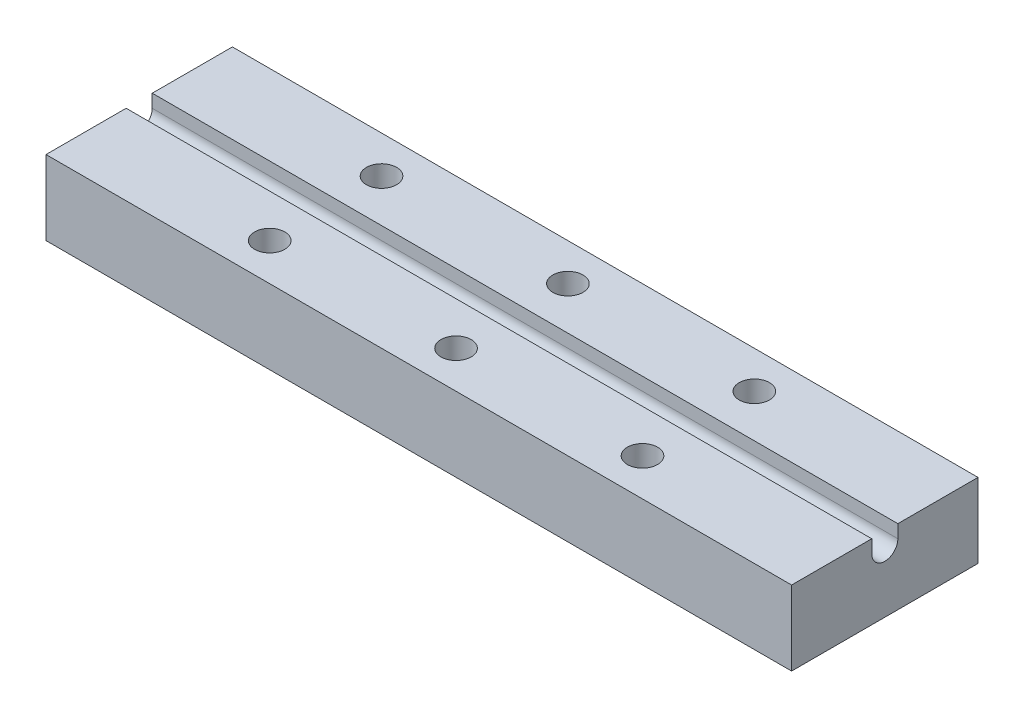
ISO-10303-21;
HEADER;
FILE_DESCRIPTION(('STEP AP214'),'2;1');
FILE_NAME('part.step','',(''),(''),'','','');
FILE_SCHEMA(('AUTOMOTIVE_DESIGN { 1 0 10303 214 1 1 1 1 }'));
ENDSEC;
DATA;
#1=APPLICATION_CONTEXT('core data for automotive mechanical design processes');
#2=APPLICATION_PROTOCOL_DEFINITION('international standard','automotive_design',2000,#1);
#3=PRODUCT_CONTEXT('',#1,'mechanical');
#4=PRODUCT('Part','Part','',(#3));
#5=PRODUCT_RELATED_PRODUCT_CATEGORY('part','',(#4));
#6=PRODUCT_DEFINITION_FORMATION('','',#4);
#7=PRODUCT_DEFINITION_CONTEXT('part definition',#1,'design');
#8=PRODUCT_DEFINITION('design','',#6,#7);
#9=PRODUCT_DEFINITION_SHAPE('','',#8);
#10=(LENGTH_UNIT() NAMED_UNIT(*) SI_UNIT(.MILLI.,.METRE.));
#11=(NAMED_UNIT(*) PLANE_ANGLE_UNIT() SI_UNIT($,.RADIAN.));
#12=(NAMED_UNIT(*) SI_UNIT($,.STERADIAN.) SOLID_ANGLE_UNIT());
#13=UNCERTAINTY_MEASURE_WITH_UNIT(LENGTH_MEASURE(1.E-05),#10,'distance_accuracy_value','');
#14=(GEOMETRIC_REPRESENTATION_CONTEXT(3) GLOBAL_UNCERTAINTY_ASSIGNED_CONTEXT((#13)) GLOBAL_UNIT_ASSIGNED_CONTEXT((#10,
#11,#12)) REPRESENTATION_CONTEXT('',''));
#15=CARTESIAN_POINT('',(0.,0.,0.));
#16=DIRECTION('',(0.,0.,1.));
#17=DIRECTION('',(1.,0.,0.));
#18=AXIS2_PLACEMENT_3D('',#15,#16,#17);
#19=CARTESIAN_POINT('',(0.,20.,0.));
#20=DIRECTION('',(0.,-1.,0.));
#21=DIRECTION('',(0.,0.,-1.));
#22=AXIS2_PLACEMENT_3D('',#19,#20,#21);
#23=PLANE('',#22);
#24=CARTESIAN_POINT('',(50.,20.,-10.0000000000007));
#25=DIRECTION('',(0.,-1.,0.));
#26=DIRECTION('',(0.,0.,-1.));
#27=AXIS2_PLACEMENT_3D('',#24,#25,#26);
#28=CIRCLE('',#27,4.04999999999999);
#29=CARTESIAN_POINT('',(50.,20.,-14.0500000000007));
#30=VERTEX_POINT('',#29);
#31=EDGE_CURVE('E180',#30,#30,#28,.T.);
#32=ORIENTED_EDGE('',*,*,#31,.T.);
#33=EDGE_LOOP('',(#32));
#34=FACE_BOUND('',#33,.T.);
#35=CARTESIAN_POINT('',(150.,20.,-10.));
#36=DIRECTION('',(0.,-1.,0.));
#37=DIRECTION('',(0.,0.,-1.));
#38=AXIS2_PLACEMENT_3D('',#35,#36,#37);
#39=CIRCLE('',#38,4.04999999999999);
#40=CARTESIAN_POINT('',(150.,20.,-14.05));
#41=VERTEX_POINT('',#40);
#42=EDGE_CURVE('E192',#41,#41,#39,.T.);
#43=ORIENTED_EDGE('',*,*,#42,.T.);
#44=EDGE_LOOP('',(#43));
#45=FACE_BOUND('',#44,.T.);
#46=CARTESIAN_POINT('',(100.,20.,-10.0000000000004));
#47=DIRECTION('',(0.,-1.,0.));
#48=DIRECTION('',(0.,0.,-1.));
#49=AXIS2_PLACEMENT_3D('',#46,#47,#48);
#50=CIRCLE('',#49,4.04999999999999);
#51=CARTESIAN_POINT('',(100.,20.,-14.0500000000003));
#52=VERTEX_POINT('',#51);
#53=EDGE_CURVE('E124',#52,#52,#50,.T.);
#54=ORIENTED_EDGE('',*,*,#53,.T.);
#55=EDGE_LOOP('',(#54));
#56=FACE_BOUND('',#55,.T.);
#57=DIRECTION('',(1.,0.,0.));
#58=VECTOR('',#57,1.);
#59=CARTESIAN_POINT('',(0.,20.,-21.5));
#60=LINE('',#59,#58);
#61=CARTESIAN_POINT('',(0.,20.,-21.5));
#62=VERTEX_POINT('',#61);
#63=CARTESIAN_POINT('',(200.,20.,-21.5));
#64=VERTEX_POINT('',#63);
#65=EDGE_CURVE('E161',#62,#64,#60,.T.);
#66=ORIENTED_EDGE('',*,*,#65,.F.);
#67=DIRECTION('',(0.,0.,1.));
#68=VECTOR('',#67,1.);
#69=CARTESIAN_POINT('',(0.,20.,0.));
#70=LINE('',#69,#68);
#71=CARTESIAN_POINT('',(0.,20.,0.));
#72=VERTEX_POINT('',#71);
#73=EDGE_CURVE('E86',#62,#72,#70,.T.);
#74=ORIENTED_EDGE('',*,*,#73,.T.);
#75=DIRECTION('',(1.,0.,0.));
#76=VECTOR('',#75,1.);
#77=CARTESIAN_POINT('',(0.,20.,0.));
#78=LINE('',#77,#76);
#79=CARTESIAN_POINT('',(200.,20.,0.));
#80=VERTEX_POINT('',#79);
#81=EDGE_CURVE('E137',#72,#80,#78,.T.);
#82=ORIENTED_EDGE('',*,*,#81,.T.);
#83=DIRECTION('',(0.,0.,-1.));
#84=VECTOR('',#83,1.);
#85=CARTESIAN_POINT('',(200.,20.,0.));
#86=LINE('',#85,#84);
#87=EDGE_CURVE('E140',#80,#64,#86,.T.);
#88=ORIENTED_EDGE('',*,*,#87,.T.);
#89=EDGE_LOOP('',(#66,#74,#82,#88));
#90=FACE_BOUND('',#89,.T.);
#91=ADVANCED_FACE('F34',(#34,#45,#56,#90),#23,.F.);
#92=CARTESIAN_POINT('',(0.,20.,0.));
#93=DIRECTION('',(1.,0.,0.));
#94=DIRECTION('',(0.,0.,-1.));
#95=AXIS2_PLACEMENT_3D('',#92,#93,#94);
#96=PLANE('',#95);
#97=CARTESIAN_POINT('',(0.,16.5,-25.));
#98=DIRECTION('',(1.,0.,0.));
#99=DIRECTION('',(0.,0.,-1.));
#100=AXIS2_PLACEMENT_3D('',#97,#98,#99);
#101=CIRCLE('',#100,3.5);
#102=CARTESIAN_POINT('',(0.,16.5,-28.5));
#103=VERTEX_POINT('',#102);
#104=CARTESIAN_POINT('',(0.,16.5,-21.5));
#105=VERTEX_POINT('',#104);
#106=EDGE_CURVE('E110',#103,#105,#101,.F.);
#107=ORIENTED_EDGE('',*,*,#106,.F.);
#108=DIRECTION('',(0.,1.,0.));
#109=VECTOR('',#108,1.);
#110=CARTESIAN_POINT('',(0.,20.,-28.5));
#111=LINE('',#110,#109);
#112=CARTESIAN_POINT('',(0.,20.,-28.5));
#113=VERTEX_POINT('',#112);
#114=EDGE_CURVE('E119',#103,#113,#111,.T.);
#115=ORIENTED_EDGE('',*,*,#114,.T.);
#116=CARTESIAN_POINT('',(0.,20.,-50.));
#117=VERTEX_POINT('',#116);
#118=EDGE_CURVE('E135',#117,#113,#70,.T.);
#119=ORIENTED_EDGE('',*,*,#118,.F.);
#120=DIRECTION('',(0.,-1.,0.));
#121=VECTOR('',#120,1.);
#122=CARTESIAN_POINT('',(0.,20.,-50.));
#123=LINE('',#122,#121);
#124=CARTESIAN_POINT('',(0.,0.,-50.));
#125=VERTEX_POINT('',#124);
#126=EDGE_CURVE('E144',#117,#125,#123,.T.);
#127=ORIENTED_EDGE('',*,*,#126,.T.);
#128=DIRECTION('',(0.,0.,1.));
#129=VECTOR('',#128,1.);
#130=CARTESIAN_POINT('',(0.,0.,0.));
#131=LINE('',#130,#129);
#132=CARTESIAN_POINT('',(0.,0.,0.));
#133=VERTEX_POINT('',#132);
#134=EDGE_CURVE('E118',#125,#133,#131,.T.);
#135=ORIENTED_EDGE('',*,*,#134,.T.);
#136=DIRECTION('',(0.,-1.,0.));
#137=VECTOR('',#136,1.);
#138=CARTESIAN_POINT('',(0.,20.,0.));
#139=LINE('',#138,#137);
#140=EDGE_CURVE('E158',#72,#133,#139,.T.);
#141=ORIENTED_EDGE('',*,*,#140,.F.);
#142=ORIENTED_EDGE('',*,*,#73,.F.);
#143=DIRECTION('',(0.,1.,0.));
#144=VECTOR('',#143,1.);
#145=CARTESIAN_POINT('',(0.,20.,-21.5));
#146=LINE('',#145,#144);
#147=EDGE_CURVE('E49',#105,#62,#146,.T.);
#148=ORIENTED_EDGE('',*,*,#147,.F.);
#149=EDGE_LOOP('',(#107,#115,#119,#127,#135,#141,#142,#148));
#150=FACE_BOUND('',#149,.T.);
#151=ADVANCED_FACE('F36',(#150),#96,.F.);
#152=CARTESIAN_POINT('',(0.,20.,0.));
#153=DIRECTION('',(0.,0.,-1.));
#154=DIRECTION('',(-1.,0.,0.));
#155=AXIS2_PLACEMENT_3D('',#152,#153,#154);
#156=PLANE('',#155);
#157=DIRECTION('',(1.,0.,0.));
#158=VECTOR('',#157,1.);
#159=CARTESIAN_POINT('',(0.,0.,0.));
#160=LINE('',#159,#158);
#161=CARTESIAN_POINT('',(200.,0.,0.));
#162=VERTEX_POINT('',#161);
#163=EDGE_CURVE('E147',#133,#162,#160,.T.);
#164=ORIENTED_EDGE('',*,*,#163,.T.);
#165=DIRECTION('',(0.,-1.,0.));
#166=VECTOR('',#165,1.);
#167=CARTESIAN_POINT('',(200.,20.,0.));
#168=LINE('',#167,#166);
#169=EDGE_CURVE('E155',#80,#162,#168,.T.);
#170=ORIENTED_EDGE('',*,*,#169,.F.);
#171=ORIENTED_EDGE('',*,*,#81,.F.);
#172=ORIENTED_EDGE('',*,*,#140,.T.);
#173=EDGE_LOOP('',(#164,#170,#171,#172));
#174=FACE_BOUND('',#173,.T.);
#175=ADVANCED_FACE('F229',(#174),#156,.F.);
#176=CARTESIAN_POINT('',(200.,20.,0.));
#177=DIRECTION('',(-1.,0.,0.));
#178=DIRECTION('',(0.,0.,1.));
#179=AXIS2_PLACEMENT_3D('',#176,#177,#178);
#180=PLANE('',#179);
#181=CARTESIAN_POINT('',(200.,20.,-28.5));
#182=VERTEX_POINT('',#181);
#183=CARTESIAN_POINT('',(200.,20.,-50.));
#184=VERTEX_POINT('',#183);
#185=EDGE_CURVE('E139',#182,#184,#86,.T.);
#186=ORIENTED_EDGE('',*,*,#185,.F.);
#187=DIRECTION('',(0.,-1.,0.));
#188=VECTOR('',#187,1.);
#189=CARTESIAN_POINT('',(200.,20.,-28.5));
#190=LINE('',#189,#188);
#191=CARTESIAN_POINT('',(200.,16.5,-28.5));
#192=VERTEX_POINT('',#191);
#193=EDGE_CURVE('E127',#182,#192,#190,.T.);
#194=ORIENTED_EDGE('',*,*,#193,.T.);
#195=CARTESIAN_POINT('',(200.,16.5,-25.));
#196=DIRECTION('',(-1.,0.,0.));
#197=DIRECTION('',(0.,0.,1.));
#198=AXIS2_PLACEMENT_3D('',#195,#196,#197);
#199=CIRCLE('',#198,3.5);
#200=CARTESIAN_POINT('',(200.,16.5,-21.5));
#201=VERTEX_POINT('',#200);
#202=EDGE_CURVE('E11',#201,#192,#199,.F.);
#203=ORIENTED_EDGE('',*,*,#202,.F.);
#204=DIRECTION('',(0.,-1.,0.));
#205=VECTOR('',#204,1.);
#206=CARTESIAN_POINT('',(200.,20.,-21.5));
#207=LINE('',#206,#205);
#208=EDGE_CURVE('E123',#64,#201,#207,.T.);
#209=ORIENTED_EDGE('',*,*,#208,.F.);
#210=ORIENTED_EDGE('',*,*,#87,.F.);
#211=ORIENTED_EDGE('',*,*,#169,.T.);
#212=DIRECTION('',(0.,0.,-1.));
#213=VECTOR('',#212,1.);
#214=CARTESIAN_POINT('',(200.,0.,0.));
#215=LINE('',#214,#213);
#216=CARTESIAN_POINT('',(200.,0.,-50.));
#217=VERTEX_POINT('',#216);
#218=EDGE_CURVE('E149',#162,#217,#215,.T.);
#219=ORIENTED_EDGE('',*,*,#218,.T.);
#220=DIRECTION('',(0.,-1.,0.));
#221=VECTOR('',#220,1.);
#222=CARTESIAN_POINT('',(200.,20.,-50.));
#223=LINE('',#222,#221);
#224=EDGE_CURVE('E153',#184,#217,#223,.T.);
#225=ORIENTED_EDGE('',*,*,#224,.F.);
#226=EDGE_LOOP('',(#186,#194,#203,#209,#210,#211,#219,#225));
#227=FACE_BOUND('',#226,.T.);
#228=ADVANCED_FACE('F169',(#227),#180,.F.);
#229=CARTESIAN_POINT('',(0.,20.,-50.));
#230=DIRECTION('',(0.,0.,1.));
#231=DIRECTION('',(1.,0.,0.));
#232=AXIS2_PLACEMENT_3D('',#229,#230,#231);
#233=PLANE('',#232);
#234=DIRECTION('',(-1.,0.,0.));
#235=VECTOR('',#234,1.);
#236=CARTESIAN_POINT('',(0.,0.,-50.));
#237=LINE('',#236,#235);
#238=EDGE_CURVE('E79',#217,#125,#237,.T.);
#239=ORIENTED_EDGE('',*,*,#238,.T.);
#240=ORIENTED_EDGE('',*,*,#126,.F.);
#241=DIRECTION('',(-1.,0.,0.));
#242=VECTOR('',#241,1.);
#243=CARTESIAN_POINT('',(0.,20.,-50.));
#244=LINE('',#243,#242);
#245=EDGE_CURVE('E58',#184,#117,#244,.T.);
#246=ORIENTED_EDGE('',*,*,#245,.F.);
#247=ORIENTED_EDGE('',*,*,#224,.T.);
#248=EDGE_LOOP('',(#239,#240,#246,#247));
#249=FACE_BOUND('',#248,.T.);
#250=ADVANCED_FACE('F171',(#249),#233,.F.);
#251=CARTESIAN_POINT('',(50.,20.,-40.0000000000007));
#252=DIRECTION('',(0.,-1.,0.));
#253=DIRECTION('',(0.,0.,-1.));
#254=AXIS2_PLACEMENT_3D('',#251,#252,#253);
#255=CIRCLE('',#254,4.04999999999999);
#256=CARTESIAN_POINT('',(50.,20.,-44.0500000000007));
#257=VERTEX_POINT('',#256);
#258=EDGE_CURVE('E183',#257,#257,#255,.T.);
#259=ORIENTED_EDGE('',*,*,#258,.T.);
#260=EDGE_LOOP('',(#259));
#261=FACE_BOUND('',#260,.T.);
#262=CARTESIAN_POINT('',(100.,20.,-40.0000000000003));
#263=DIRECTION('',(0.,-1.,0.));
#264=DIRECTION('',(0.,0.,-1.));
#265=AXIS2_PLACEMENT_3D('',#262,#263,#264);
#266=CIRCLE('',#265,4.04999999999999);
#267=CARTESIAN_POINT('',(100.,20.,-44.0500000000003));
#268=VERTEX_POINT('',#267);
#269=EDGE_CURVE('E186',#268,#268,#266,.T.);
#270=ORIENTED_EDGE('',*,*,#269,.T.);
#271=EDGE_LOOP('',(#270));
#272=FACE_BOUND('',#271,.T.);
#273=CARTESIAN_POINT('',(150.,20.,-40.));
#274=DIRECTION('',(0.,-1.,0.));
#275=DIRECTION('',(0.,0.,-1.));
#276=AXIS2_PLACEMENT_3D('',#273,#274,#275);
#277=CIRCLE('',#276,4.04999999999999);
#278=CARTESIAN_POINT('',(150.,20.,-44.05));
#279=VERTEX_POINT('',#278);
#280=EDGE_CURVE('E189',#279,#279,#277,.T.);
#281=ORIENTED_EDGE('',*,*,#280,.T.);
#282=EDGE_LOOP('',(#281));
#283=FACE_BOUND('',#282,.T.);
#284=ORIENTED_EDGE('',*,*,#118,.T.);
#285=DIRECTION('',(1.,0.,0.));
#286=VECTOR('',#285,1.);
#287=CARTESIAN_POINT('',(0.,20.,-28.5));
#288=LINE('',#287,#286);
#289=EDGE_CURVE('E42',#113,#182,#288,.T.);
#290=ORIENTED_EDGE('',*,*,#289,.T.);
#291=ORIENTED_EDGE('',*,*,#185,.T.);
#292=ORIENTED_EDGE('',*,*,#245,.T.);
#293=EDGE_LOOP('',(#284,#290,#291,#292));
#294=FACE_BOUND('',#293,.T.);
#295=ADVANCED_FACE('F164',(#261,#272,#283,#294),#23,.F.);
#296=CARTESIAN_POINT('',(0.,0.,0.));
#297=DIRECTION('',(0.,-1.,0.));
#298=DIRECTION('',(0.,0.,-1.));
#299=AXIS2_PLACEMENT_3D('',#296,#297,#298);
#300=PLANE('',#299);
#301=CARTESIAN_POINT('',(50.,0.,-10.0000000000007));
#302=DIRECTION('',(0.,-1.,0.));
#303=DIRECTION('',(0.,0.,-1.));
#304=AXIS2_PLACEMENT_3D('',#301,#302,#303);
#305=CIRCLE('',#304,4.04999999999999);
#306=CARTESIAN_POINT('',(50.,0.,-14.0500000000007));
#307=VERTEX_POINT('',#306);
#308=EDGE_CURVE('E195',#307,#307,#305,.T.);
#309=ORIENTED_EDGE('',*,*,#308,.F.);
#310=EDGE_LOOP('',(#309));
#311=FACE_BOUND('',#310,.T.);
#312=CARTESIAN_POINT('',(50.,0.,-40.0000000000007));
#313=DIRECTION('',(0.,-1.,0.));
#314=DIRECTION('',(0.,0.,-1.));
#315=AXIS2_PLACEMENT_3D('',#312,#313,#314);
#316=CIRCLE('',#315,4.04999999999999);
#317=CARTESIAN_POINT('',(50.,0.,-44.0500000000007));
#318=VERTEX_POINT('',#317);
#319=EDGE_CURVE('E205',#318,#318,#316,.T.);
#320=ORIENTED_EDGE('',*,*,#319,.F.);
#321=EDGE_LOOP('',(#320));
#322=FACE_BOUND('',#321,.T.);
#323=CARTESIAN_POINT('',(100.,0.,-40.0000000000003));
#324=DIRECTION('',(0.,-1.,0.));
#325=DIRECTION('',(0.,0.,-1.));
#326=AXIS2_PLACEMENT_3D('',#323,#324,#325);
#327=CIRCLE('',#326,4.04999999999999);
#328=CARTESIAN_POINT('',(100.,0.,-44.0500000000003));
#329=VERTEX_POINT('',#328);
#330=EDGE_CURVE('E202',#329,#329,#327,.T.);
#331=ORIENTED_EDGE('',*,*,#330,.F.);
#332=EDGE_LOOP('',(#331));
#333=FACE_BOUND('',#332,.T.);
#334=CARTESIAN_POINT('',(150.,0.,-40.));
#335=DIRECTION('',(0.,-1.,0.));
#336=DIRECTION('',(0.,0.,-1.));
#337=AXIS2_PLACEMENT_3D('',#334,#335,#336);
#338=CIRCLE('',#337,4.04999999999999);
#339=CARTESIAN_POINT('',(150.,0.,-44.05));
#340=VERTEX_POINT('',#339);
#341=EDGE_CURVE('E199',#340,#340,#338,.T.);
#342=ORIENTED_EDGE('',*,*,#341,.F.);
#343=EDGE_LOOP('',(#342));
#344=FACE_BOUND('',#343,.T.);
#345=CARTESIAN_POINT('',(150.,0.,-10.));
#346=DIRECTION('',(0.,-1.,0.));
#347=DIRECTION('',(0.,0.,-1.));
#348=AXIS2_PLACEMENT_3D('',#345,#346,#347);
#349=CIRCLE('',#348,4.04999999999999);
#350=CARTESIAN_POINT('',(150.,0.,-14.05));
#351=VERTEX_POINT('',#350);
#352=EDGE_CURVE('E196',#351,#351,#349,.T.);
#353=ORIENTED_EDGE('',*,*,#352,.F.);
#354=EDGE_LOOP('',(#353));
#355=FACE_BOUND('',#354,.T.);
#356=CARTESIAN_POINT('',(100.,0.,-10.0000000000004));
#357=DIRECTION('',(0.,-1.,0.));
#358=DIRECTION('',(0.,0.,-1.));
#359=AXIS2_PLACEMENT_3D('',#356,#357,#358);
#360=CIRCLE('',#359,4.04999999999999);
#361=CARTESIAN_POINT('',(100.,0.,-14.0500000000003));
#362=VERTEX_POINT('',#361);
#363=EDGE_CURVE('E177',#362,#362,#360,.T.);
#364=ORIENTED_EDGE('',*,*,#363,.F.);
#365=EDGE_LOOP('',(#364));
#366=FACE_BOUND('',#365,.T.);
#367=ORIENTED_EDGE('',*,*,#134,.F.);
#368=ORIENTED_EDGE('',*,*,#238,.F.);
#369=ORIENTED_EDGE('',*,*,#218,.F.);
#370=ORIENTED_EDGE('',*,*,#163,.F.);
#371=EDGE_LOOP('',(#367,#368,#369,#370));
#372=FACE_BOUND('',#371,.T.);
#373=ADVANCED_FACE('F214',(#311,#322,#333,#344,#355,#366,#372),#300,.T.);
#374=CARTESIAN_POINT('',(-30.,16.5,-25.));
#375=DIRECTION('',(1.,0.,0.));
#376=DIRECTION('',(0.,0.,-1.));
#377=AXIS2_PLACEMENT_3D('',#374,#375,#376);
#378=CYLINDRICAL_SURFACE('',#377,3.5);
#379=ORIENTED_EDGE('',*,*,#106,.T.);
#380=DIRECTION('',(1.,0.,0.));
#381=VECTOR('',#380,1.);
#382=CARTESIAN_POINT('',(-30.,16.5,-21.5));
#383=LINE('',#382,#381);
#384=EDGE_CURVE('E112',#105,#201,#383,.T.);
#385=ORIENTED_EDGE('',*,*,#384,.T.);
#386=ORIENTED_EDGE('',*,*,#202,.T.);
#387=DIRECTION('',(1.,0.,0.));
#388=VECTOR('',#387,1.);
#389=CARTESIAN_POINT('',(-30.,16.5,-28.5));
#390=LINE('',#389,#388);
#391=EDGE_CURVE('E115',#103,#192,#390,.T.);
#392=ORIENTED_EDGE('',*,*,#391,.F.);
#393=EDGE_LOOP('',(#379,#385,#386,#392));
#394=FACE_BOUND('',#393,.T.);
#395=ADVANCED_FACE('F111',(#394),#378,.F.);
#396=CARTESIAN_POINT('',(-30.,0.,-28.5));
#397=DIRECTION('',(0.,0.,-1.));
#398=DIRECTION('',(-1.,0.,0.));
#399=AXIS2_PLACEMENT_3D('',#396,#397,#398);
#400=PLANE('',#399);
#401=ORIENTED_EDGE('',*,*,#391,.T.);
#402=ORIENTED_EDGE('',*,*,#193,.F.);
#403=ORIENTED_EDGE('',*,*,#289,.F.);
#404=ORIENTED_EDGE('',*,*,#114,.F.);
#405=EDGE_LOOP('',(#401,#402,#403,#404));
#406=FACE_BOUND('',#405,.T.);
#407=ADVANCED_FACE('F173',(#406),#400,.F.);
#408=CARTESIAN_POINT('',(-30.,0.,-21.5));
#409=DIRECTION('',(0.,0.,-1.));
#410=DIRECTION('',(-1.,0.,0.));
#411=AXIS2_PLACEMENT_3D('',#408,#409,#410);
#412=PLANE('',#411);
#413=ORIENTED_EDGE('',*,*,#147,.T.);
#414=ORIENTED_EDGE('',*,*,#65,.T.);
#415=ORIENTED_EDGE('',*,*,#208,.T.);
#416=ORIENTED_EDGE('',*,*,#384,.F.);
#417=EDGE_LOOP('',(#413,#414,#415,#416));
#418=FACE_BOUND('',#417,.T.);
#419=ADVANCED_FACE('F121',(#418),#412,.T.);
#420=CARTESIAN_POINT('',(100.,67.,-10.0000000000004));
#421=DIRECTION('',(0.,-1.,0.));
#422=DIRECTION('',(0.,0.,-1.));
#423=AXIS2_PLACEMENT_3D('',#420,#421,#422);
#424=CYLINDRICAL_SURFACE('',#423,4.04999999999999);
#425=ORIENTED_EDGE('',*,*,#363,.T.);
#426=EDGE_LOOP('',(#425));
#427=FACE_BOUND('',#426,.T.);
#428=ORIENTED_EDGE('',*,*,#53,.F.);
#429=EDGE_LOOP('',(#428));
#430=FACE_BOUND('',#429,.T.);
#431=ADVANCED_FACE('F265',(#427,#430),#424,.F.);
#432=CARTESIAN_POINT('',(150.,67.,-10.));
#433=DIRECTION('',(0.,-1.,0.));
#434=DIRECTION('',(0.,0.,-1.));
#435=AXIS2_PLACEMENT_3D('',#432,#433,#434);
#436=CYLINDRICAL_SURFACE('',#435,4.04999999999999);
#437=ORIENTED_EDGE('',*,*,#352,.T.);
#438=EDGE_LOOP('',(#437));
#439=FACE_BOUND('',#438,.T.);
#440=ORIENTED_EDGE('',*,*,#42,.F.);
#441=EDGE_LOOP('',(#440));
#442=FACE_BOUND('',#441,.T.);
#443=ADVANCED_FACE('F255',(#439,#442),#436,.F.);
#444=CARTESIAN_POINT('',(150.,67.,-40.));
#445=DIRECTION('',(0.,-1.,0.));
#446=DIRECTION('',(0.,0.,-1.));
#447=AXIS2_PLACEMENT_3D('',#444,#445,#446);
#448=CYLINDRICAL_SURFACE('',#447,4.04999999999999);
#449=ORIENTED_EDGE('',*,*,#341,.T.);
#450=EDGE_LOOP('',(#449));
#451=FACE_BOUND('',#450,.T.);
#452=ORIENTED_EDGE('',*,*,#280,.F.);
#453=EDGE_LOOP('',(#452));
#454=FACE_BOUND('',#453,.T.);
#455=ADVANCED_FACE('F252',(#451,#454),#448,.F.);
#456=CARTESIAN_POINT('',(100.,67.,-40.0000000000003));
#457=DIRECTION('',(0.,-1.,0.));
#458=DIRECTION('',(0.,0.,-1.));
#459=AXIS2_PLACEMENT_3D('',#456,#457,#458);
#460=CYLINDRICAL_SURFACE('',#459,4.04999999999999);
#461=ORIENTED_EDGE('',*,*,#330,.T.);
#462=EDGE_LOOP('',(#461));
#463=FACE_BOUND('',#462,.T.);
#464=ORIENTED_EDGE('',*,*,#269,.F.);
#465=EDGE_LOOP('',(#464));
#466=FACE_BOUND('',#465,.T.);
#467=ADVANCED_FACE('F254',(#463,#466),#460,.F.);
#468=CARTESIAN_POINT('',(50.,67.,-40.0000000000007));
#469=DIRECTION('',(0.,-1.,0.));
#470=DIRECTION('',(0.,0.,-1.));
#471=AXIS2_PLACEMENT_3D('',#468,#469,#470);
#472=CYLINDRICAL_SURFACE('',#471,4.04999999999999);
#473=ORIENTED_EDGE('',*,*,#319,.T.);
#474=EDGE_LOOP('',(#473));
#475=FACE_BOUND('',#474,.T.);
#476=ORIENTED_EDGE('',*,*,#258,.F.);
#477=EDGE_LOOP('',(#476));
#478=FACE_BOUND('',#477,.T.);
#479=ADVANCED_FACE('F262',(#475,#478),#472,.F.);
#480=CARTESIAN_POINT('',(50.,67.,-10.0000000000007));
#481=DIRECTION('',(0.,-1.,0.));
#482=DIRECTION('',(0.,0.,-1.));
#483=AXIS2_PLACEMENT_3D('',#480,#481,#482);
#484=CYLINDRICAL_SURFACE('',#483,4.04999999999999);
#485=ORIENTED_EDGE('',*,*,#308,.T.);
#486=EDGE_LOOP('',(#485));
#487=FACE_BOUND('',#486,.T.);
#488=ORIENTED_EDGE('',*,*,#31,.F.);
#489=EDGE_LOOP('',(#488));
#490=FACE_BOUND('',#489,.T.);
#491=ADVANCED_FACE('F211',(#487,#490),#484,.F.);
#492=CLOSED_SHELL('',(#91,#151,#175,#228,#250,#295,#373,#395,#407,#419,#431,#443,#455,#467,#479,#491));
#493=MANIFOLD_SOLID_BREP('B2',#492);
#494=ADVANCED_BREP_SHAPE_REPRESENTATION('',(#18,#493),#14);
#495=SHAPE_DEFINITION_REPRESENTATION(#9,#494);
ENDSEC;
END-ISO-10303-21;
